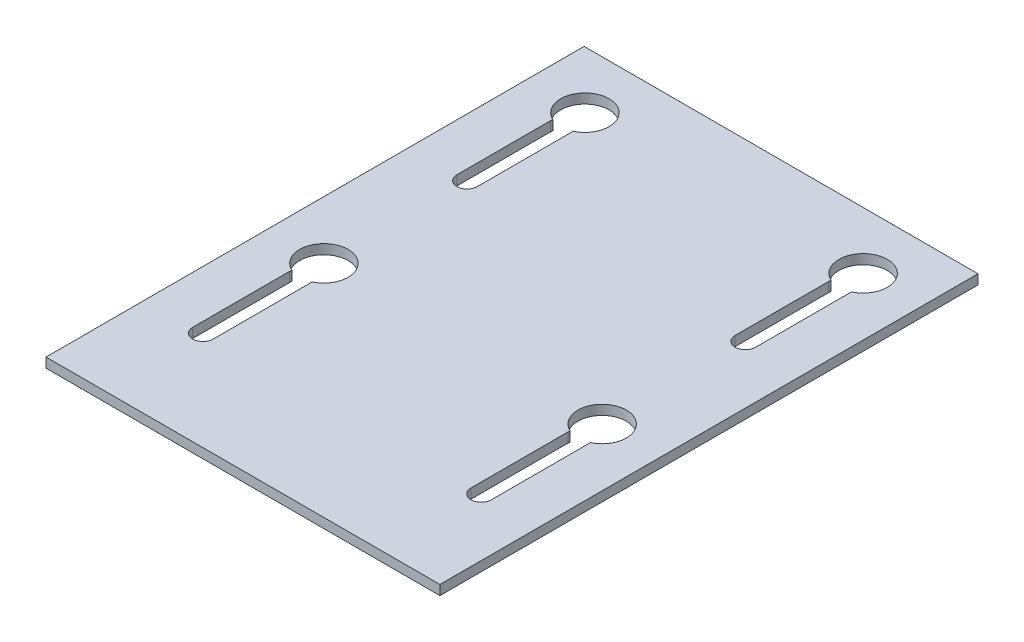
ISO-10303-21;
HEADER;
FILE_DESCRIPTION(('STEP AP214'),'2;1');
FILE_NAME('part.step','',(''),(''),'','','');
FILE_SCHEMA(('AUTOMOTIVE_DESIGN { 1 0 10303 214 1 1 1 1 }'));
ENDSEC;
DATA;
#1=APPLICATION_CONTEXT('core data for automotive mechanical design processes');
#2=APPLICATION_PROTOCOL_DEFINITION('international standard','automotive_design',2000,#1);
#3=PRODUCT_CONTEXT('',#1,'mechanical');
#4=PRODUCT('Part','Part','',(#3));
#5=PRODUCT_RELATED_PRODUCT_CATEGORY('part','',(#4));
#6=PRODUCT_DEFINITION_FORMATION('','',#4);
#7=PRODUCT_DEFINITION_CONTEXT('part definition',#1,'design');
#8=PRODUCT_DEFINITION('design','',#6,#7);
#9=PRODUCT_DEFINITION_SHAPE('','',#8);
#10=(LENGTH_UNIT() NAMED_UNIT(*) SI_UNIT(.MILLI.,.METRE.));
#11=(NAMED_UNIT(*) PLANE_ANGLE_UNIT() SI_UNIT($,.RADIAN.));
#12=(NAMED_UNIT(*) SI_UNIT($,.STERADIAN.) SOLID_ANGLE_UNIT());
#13=UNCERTAINTY_MEASURE_WITH_UNIT(LENGTH_MEASURE(1.E-05),#10,'distance_accuracy_value','');
#14=(GEOMETRIC_REPRESENTATION_CONTEXT(3) GLOBAL_UNCERTAINTY_ASSIGNED_CONTEXT((#13)) GLOBAL_UNIT_ASSIGNED_CONTEXT((#10,
#11,#12)) REPRESENTATION_CONTEXT('',''));
#15=CARTESIAN_POINT('',(0.,0.,0.));
#16=DIRECTION('',(0.,0.,1.));
#17=DIRECTION('',(1.,0.,0.));
#18=AXIS2_PLACEMENT_3D('',#15,#16,#17);
#19=CARTESIAN_POINT('',(0.,3.,0.));
#20=DIRECTION('',(0.,-1.,0.));
#21=DIRECTION('',(0.,0.,-1.));
#22=AXIS2_PLACEMENT_3D('',#19,#20,#21);
#23=PLANE('',#22);
#24=CARTESIAN_POINT('',(104.18,3.,-49.72));
#25=DIRECTION('',(0.,-1.,0.));
#26=DIRECTION('',(0.,0.,-1.));
#27=AXIS2_PLACEMENT_3D('',#24,#25,#26);
#28=CIRCLE('',#27,3.16499999999999);
#29=CARTESIAN_POINT('',(107.345,3.,-49.72));
#30=VERTEX_POINT('',#29);
#31=CARTESIAN_POINT('',(101.015,3.,-49.72));
#32=VERTEX_POINT('',#31);
#33=EDGE_CURVE('E359',#30,#32,#28,.T.);
#34=ORIENTED_EDGE('',*,*,#33,.T.);
#35=DIRECTION('',(0.,0.,1.));
#36=VECTOR('',#35,1.);
#37=CARTESIAN_POINT('',(101.015,3.,-79.72));
#38=LINE('',#37,#36);
#39=CARTESIAN_POINT('',(101.015,3.,-79.72));
#40=VERTEX_POINT('',#39);
#41=EDGE_CURVE('E355',#40,#32,#38,.T.);
#42=ORIENTED_EDGE('',*,*,#41,.F.);
#43=CARTESIAN_POINT('',(104.18,3.,-79.72));
#44=DIRECTION('',(0.,-1.,0.));
#45=DIRECTION('',(0.,0.,-1.));
#46=AXIS2_PLACEMENT_3D('',#43,#44,#45);
#47=CIRCLE('',#46,3.16499999999999);
#48=CARTESIAN_POINT('',(101.086256616043,3.,-80.387815));
#49=VERTEX_POINT('',#48);
#50=EDGE_CURVE('E368',#40,#49,#47,.T.);
#51=ORIENTED_EDGE('',*,*,#50,.T.);
#52=CARTESIAN_POINT('',(104.18,3.,-87.22));
#53=DIRECTION('',(0.,-1.,0.));
#54=DIRECTION('',(0.,0.,-1.));
#55=AXIS2_PLACEMENT_3D('',#52,#53,#54);
#56=CIRCLE('',#55,7.50000000000001);
#57=CARTESIAN_POINT('',(107.273743383957,3.,-80.387815));
#58=VERTEX_POINT('',#57);
#59=EDGE_CURVE('E345',#49,#58,#56,.T.);
#60=ORIENTED_EDGE('',*,*,#59,.T.);
#61=CARTESIAN_POINT('',(107.345,3.,-79.72));
#62=VERTEX_POINT('',#61);
#63=EDGE_CURVE('E372',#58,#62,#47,.T.);
#64=ORIENTED_EDGE('',*,*,#63,.T.);
#65=DIRECTION('',(0.,0.,1.));
#66=VECTOR('',#65,1.);
#67=CARTESIAN_POINT('',(107.345,3.,-79.72));
#68=LINE('',#67,#66);
#69=EDGE_CURVE('E364',#62,#30,#68,.T.);
#70=ORIENTED_EDGE('',*,*,#69,.T.);
#71=EDGE_LOOP('',(#34,#42,#51,#60,#64,#70));
#72=FACE_BOUND('',#71,.T.);
#73=CARTESIAN_POINT('',(104.18,3.,-131.62));
#74=DIRECTION('',(0.,-1.,0.));
#75=DIRECTION('',(0.,0.,-1.));
#76=AXIS2_PLACEMENT_3D('',#73,#74,#75);
#77=CIRCLE('',#76,3.16772898999997);
#78=CARTESIAN_POINT('',(107.34772899,3.,-131.62));
#79=VERTEX_POINT('',#78);
#80=CARTESIAN_POINT('',(101.01227101,3.,-131.62));
#81=VERTEX_POINT('',#80);
#82=EDGE_CURVE('E543',#79,#81,#77,.T.);
#83=ORIENTED_EDGE('',*,*,#82,.T.);
#84=DIRECTION('',(0.,0.,1.));
#85=VECTOR('',#84,1.);
#86=CARTESIAN_POINT('',(101.01227101,3.,-160.62));
#87=LINE('',#86,#85);
#88=CARTESIAN_POINT('',(101.01227101,3.,-160.62));
#89=VERTEX_POINT('',#88);
#90=EDGE_CURVE('E547',#89,#81,#87,.T.);
#91=ORIENTED_EDGE('',*,*,#90,.F.);
#92=CARTESIAN_POINT('',(104.18,3.,-160.62));
#93=DIRECTION('',(0.,-1.,0.));
#94=DIRECTION('',(0.,0.,-1.));
#95=AXIS2_PLACEMENT_3D('',#92,#93,#94);
#96=CIRCLE('',#95,3.16772898999995);
#97=CARTESIAN_POINT('',(101.083713525414,3.,-161.288967130272));
#98=VERTEX_POINT('',#97);
#99=EDGE_CURVE('E534',#89,#98,#96,.T.);
#100=ORIENTED_EDGE('',*,*,#99,.T.);
#101=CARTESIAN_POINT('',(104.18,3.,-168.12));
#102=DIRECTION('',(0.,-1.,0.));
#103=DIRECTION('',(0.,0.,-1.));
#104=AXIS2_PLACEMENT_3D('',#101,#102,#103);
#105=CIRCLE('',#104,7.50000000000003);
#106=CARTESIAN_POINT('',(107.276286474586,3.,-161.288967130272));
#107=VERTEX_POINT('',#106);
#108=EDGE_CURVE('E513',#98,#107,#105,.T.);
#109=ORIENTED_EDGE('',*,*,#108,.T.);
#110=CARTESIAN_POINT('',(107.34772899,3.,-160.62));
#111=VERTEX_POINT('',#110);
#112=EDGE_CURVE('E539',#107,#111,#96,.T.);
#113=ORIENTED_EDGE('',*,*,#112,.T.);
#114=DIRECTION('',(0.,0.,1.));
#115=VECTOR('',#114,1.);
#116=CARTESIAN_POINT('',(107.34772899,3.,-160.62));
#117=LINE('',#116,#115);
#118=EDGE_CURVE('E538',#111,#79,#117,.T.);
#119=ORIENTED_EDGE('',*,*,#118,.T.);
#120=EDGE_LOOP('',(#83,#91,#100,#109,#113,#119));
#121=FACE_BOUND('',#120,.T.);
#122=CARTESIAN_POINT('',(17.92,3.,-87.22));
#123=DIRECTION('',(0.,1.,0.));
#124=DIRECTION('',(0.,0.,1.));
#125=AXIS2_PLACEMENT_3D('',#122,#123,#124);
#126=CIRCLE('',#125,7.5);
#127=CARTESIAN_POINT('',(21.0137433839565,3.,-80.387815));
#128=VERTEX_POINT('',#127);
#129=CARTESIAN_POINT('',(14.8262566160434,3.,-80.387815));
#130=VERTEX_POINT('',#129);
#131=EDGE_CURVE('E337',#128,#130,#126,.T.);
#132=ORIENTED_EDGE('',*,*,#131,.F.);
#133=CARTESIAN_POINT('',(17.92,3.,-79.72));
#134=DIRECTION('',(0.,1.,0.));
#135=DIRECTION('',(0.,0.,1.));
#136=AXIS2_PLACEMENT_3D('',#133,#134,#135);
#137=CIRCLE('',#136,3.16499999999999);
#138=CARTESIAN_POINT('',(21.085,3.,-79.72));
#139=VERTEX_POINT('',#138);
#140=EDGE_CURVE('E433',#139,#128,#137,.T.);
#141=ORIENTED_EDGE('',*,*,#140,.F.);
#142=DIRECTION('',(0.,0.,1.));
#143=VECTOR('',#142,1.);
#144=CARTESIAN_POINT('',(21.085,3.,-79.72));
#145=LINE('',#144,#143);
#146=CARTESIAN_POINT('',(21.085,3.,-49.72));
#147=VERTEX_POINT('',#146);
#148=EDGE_CURVE('E420',#139,#147,#145,.T.);
#149=ORIENTED_EDGE('',*,*,#148,.T.);
#150=CARTESIAN_POINT('',(17.92,3.,-49.72));
#151=DIRECTION('',(0.,1.,0.));
#152=DIRECTION('',(0.,0.,1.));
#153=AXIS2_PLACEMENT_3D('',#150,#151,#152);
#154=CIRCLE('',#153,3.16499999999998);
#155=CARTESIAN_POINT('',(14.755,3.,-49.72));
#156=VERTEX_POINT('',#155);
#157=EDGE_CURVE('E424',#156,#147,#154,.T.);
#158=ORIENTED_EDGE('',*,*,#157,.F.);
#159=DIRECTION('',(0.,0.,1.));
#160=VECTOR('',#159,1.);
#161=CARTESIAN_POINT('',(14.755,3.,-79.72));
#162=LINE('',#161,#160);
#163=CARTESIAN_POINT('',(14.755,3.,-79.72));
#164=VERTEX_POINT('',#163);
#165=EDGE_CURVE('E429',#164,#156,#162,.T.);
#166=ORIENTED_EDGE('',*,*,#165,.F.);
#167=EDGE_CURVE('E406',#130,#164,#137,.T.);
#168=ORIENTED_EDGE('',*,*,#167,.F.);
#169=EDGE_LOOP('',(#132,#141,#149,#158,#166,#168));
#170=FACE_BOUND('',#169,.T.);
#171=DIRECTION('',(0.,0.,1.));
#172=VECTOR('',#171,1.);
#173=CARTESIAN_POINT('',(21.0877289899999,3.,-160.62));
#174=LINE('',#173,#172);
#175=CARTESIAN_POINT('',(21.0877289899999,3.,-160.62));
#176=VERTEX_POINT('',#175);
#177=CARTESIAN_POINT('',(21.0877289899999,3.,-131.62));
#178=VERTEX_POINT('',#177);
#179=EDGE_CURVE('E466',#176,#178,#174,.T.);
#180=ORIENTED_EDGE('',*,*,#179,.T.);
#181=CARTESIAN_POINT('',(17.92,3.,-131.62));
#182=DIRECTION('',(0.,1.,0.));
#183=DIRECTION('',(0.,0.,1.));
#184=AXIS2_PLACEMENT_3D('',#181,#182,#183);
#185=CIRCLE('',#184,3.16772898999996);
#186=CARTESIAN_POINT('',(14.75227101,3.,-131.62));
#187=VERTEX_POINT('',#186);
#188=EDGE_CURVE('E470',#187,#178,#185,.T.);
#189=ORIENTED_EDGE('',*,*,#188,.F.);
#190=DIRECTION('',(0.,0.,1.));
#191=VECTOR('',#190,1.);
#192=CARTESIAN_POINT('',(14.75227101,3.,-160.62));
#193=LINE('',#192,#191);
#194=CARTESIAN_POINT('',(14.75227101,3.,-160.62));
#195=VERTEX_POINT('',#194);
#196=EDGE_CURVE('E475',#195,#187,#193,.T.);
#197=ORIENTED_EDGE('',*,*,#196,.F.);
#198=CARTESIAN_POINT('',(17.92,3.,-160.62));
#199=DIRECTION('',(0.,1.,0.));
#200=DIRECTION('',(0.,0.,1.));
#201=AXIS2_PLACEMENT_3D('',#198,#199,#200);
#202=CIRCLE('',#201,3.16772898999996);
#203=CARTESIAN_POINT('',(14.8237135254144,3.,-161.288967130272));
#204=VERTEX_POINT('',#203);
#205=EDGE_CURVE('E395',#204,#195,#202,.T.);
#206=ORIENTED_EDGE('',*,*,#205,.F.);
#207=CARTESIAN_POINT('',(17.92,3.,-168.12));
#208=DIRECTION('',(0.,1.,0.));
#209=DIRECTION('',(0.,0.,1.));
#210=AXIS2_PLACEMENT_3D('',#207,#208,#209);
#211=CIRCLE('',#210,7.5);
#212=CARTESIAN_POINT('',(21.0162864745855,3.,-161.288967130272));
#213=VERTEX_POINT('',#212);
#214=EDGE_CURVE('E465',#213,#204,#211,.T.);
#215=ORIENTED_EDGE('',*,*,#214,.F.);
#216=EDGE_CURVE('E479',#176,#213,#202,.T.);
#217=ORIENTED_EDGE('',*,*,#216,.F.);
#218=EDGE_LOOP('',(#180,#189,#197,#206,#215,#217));
#219=FACE_BOUND('',#218,.T.);
#220=DIRECTION('',(-1.,0.,0.));
#221=VECTOR('',#220,1.);
#222=CARTESIAN_POINT('',(0.,3.,-19.));
#223=LINE('',#222,#221);
#224=CARTESIAN_POINT('',(122.1,3.,-19.));
#225=VERTEX_POINT('',#224);
#226=CARTESIAN_POINT('',(0.,3.,-19.));
#227=VERTEX_POINT('',#226);
#228=EDGE_CURVE('E286',#225,#227,#223,.T.);
#229=ORIENTED_EDGE('',*,*,#228,.F.);
#230=DIRECTION('',(0.,0.,-1.));
#231=VECTOR('',#230,1.);
#232=CARTESIAN_POINT('',(122.1,3.,0.));
#233=LINE('',#232,#231);
#234=CARTESIAN_POINT('',(122.1,3.,-185.8));
#235=VERTEX_POINT('',#234);
#236=EDGE_CURVE('E124',#225,#235,#233,.T.);
#237=ORIENTED_EDGE('',*,*,#236,.T.);
#238=DIRECTION('',(1.,0.,0.));
#239=VECTOR('',#238,1.);
#240=CARTESIAN_POINT('',(0.,3.,-185.8));
#241=LINE('',#240,#239);
#242=CARTESIAN_POINT('',(0.,3.,-185.8));
#243=VERTEX_POINT('',#242);
#244=EDGE_CURVE('E319',#243,#235,#241,.T.);
#245=ORIENTED_EDGE('',*,*,#244,.F.);
#246=DIRECTION('',(0.,0.,1.));
#247=VECTOR('',#246,1.);
#248=CARTESIAN_POINT('',(0.,3.,0.));
#249=LINE('',#248,#247);
#250=EDGE_CURVE('E292',#243,#227,#249,.T.);
#251=ORIENTED_EDGE('',*,*,#250,.T.);
#252=EDGE_LOOP('',(#229,#237,#245,#251));
#253=FACE_BOUND('',#252,.T.);
#254=ADVANCED_FACE('F101',(#72,#121,#170,#219,#253),#23,.F.);
#255=CARTESIAN_POINT('',(0.,0.,0.));
#256=DIRECTION('',(0.,-1.,0.));
#257=DIRECTION('',(0.,0.,-1.));
#258=AXIS2_PLACEMENT_3D('',#255,#256,#257);
#259=PLANE('',#258);
#260=CARTESIAN_POINT('',(17.92,0.,-79.72));
#261=DIRECTION('',(0.,1.,0.));
#262=DIRECTION('',(0.,0.,1.));
#263=AXIS2_PLACEMENT_3D('',#260,#261,#262);
#264=CIRCLE('',#263,3.16499999999999);
#265=CARTESIAN_POINT('',(21.085,0.,-79.72));
#266=VERTEX_POINT('',#265);
#267=CARTESIAN_POINT('',(21.0137433839565,0.,-80.387815));
#268=VERTEX_POINT('',#267);
#269=EDGE_CURVE('E446',#266,#268,#264,.T.);
#270=ORIENTED_EDGE('',*,*,#269,.T.);
#271=CARTESIAN_POINT('',(17.92,0.,-87.22));
#272=DIRECTION('',(0.,1.,0.));
#273=DIRECTION('',(0.,0.,1.));
#274=AXIS2_PLACEMENT_3D('',#271,#272,#273);
#275=CIRCLE('',#274,7.5);
#276=CARTESIAN_POINT('',(14.8262566160434,0.,-80.387815));
#277=VERTEX_POINT('',#276);
#278=EDGE_CURVE('E402',#268,#277,#275,.T.);
#279=ORIENTED_EDGE('',*,*,#278,.T.);
#280=CARTESIAN_POINT('',(14.755,0.,-79.72));
#281=VERTEX_POINT('',#280);
#282=EDGE_CURVE('E425',#277,#281,#264,.T.);
#283=ORIENTED_EDGE('',*,*,#282,.T.);
#284=DIRECTION('',(0.,0.,1.));
#285=VECTOR('',#284,1.);
#286=CARTESIAN_POINT('',(14.755,0.,-79.72));
#287=LINE('',#286,#285);
#288=CARTESIAN_POINT('',(14.755,0.,-49.72));
#289=VERTEX_POINT('',#288);
#290=EDGE_CURVE('E442',#281,#289,#287,.T.);
#291=ORIENTED_EDGE('',*,*,#290,.T.);
#292=CARTESIAN_POINT('',(17.92,0.,-49.72));
#293=DIRECTION('',(0.,1.,0.));
#294=DIRECTION('',(0.,0.,1.));
#295=AXIS2_PLACEMENT_3D('',#292,#293,#294);
#296=CIRCLE('',#295,3.16499999999998);
#297=CARTESIAN_POINT('',(21.085,0.,-49.72));
#298=VERTEX_POINT('',#297);
#299=EDGE_CURVE('E438',#289,#298,#296,.T.);
#300=ORIENTED_EDGE('',*,*,#299,.T.);
#301=DIRECTION('',(0.,0.,1.));
#302=VECTOR('',#301,1.);
#303=CARTESIAN_POINT('',(21.085,0.,-79.72));
#304=LINE('',#303,#302);
#305=EDGE_CURVE('E411',#266,#298,#304,.T.);
#306=ORIENTED_EDGE('',*,*,#305,.F.);
#307=EDGE_LOOP('',(#270,#279,#283,#291,#300,#306));
#308=FACE_BOUND('',#307,.T.);
#309=DIRECTION('',(0.,0.,1.));
#310=VECTOR('',#309,1.);
#311=CARTESIAN_POINT('',(101.015,0.,-79.72));
#312=LINE('',#311,#310);
#313=CARTESIAN_POINT('',(101.015,0.,-79.72));
#314=VERTEX_POINT('',#313);
#315=CARTESIAN_POINT('',(101.015,0.,-49.72));
#316=VERTEX_POINT('',#315);
#317=EDGE_CURVE('E354',#314,#316,#312,.T.);
#318=ORIENTED_EDGE('',*,*,#317,.T.);
#319=CARTESIAN_POINT('',(104.18,0.,-49.72));
#320=DIRECTION('',(0.,-1.,0.));
#321=DIRECTION('',(0.,0.,-1.));
#322=AXIS2_PLACEMENT_3D('',#319,#320,#321);
#323=CIRCLE('',#322,3.16499999999999);
#324=CARTESIAN_POINT('',(107.345,0.,-49.72));
#325=VERTEX_POINT('',#324);
#326=EDGE_CURVE('E376',#325,#316,#323,.T.);
#327=ORIENTED_EDGE('',*,*,#326,.F.);
#328=DIRECTION('',(0.,0.,1.));
#329=VECTOR('',#328,1.);
#330=CARTESIAN_POINT('',(107.345,0.,-79.72));
#331=LINE('',#330,#329);
#332=CARTESIAN_POINT('',(107.345,0.,-79.72));
#333=VERTEX_POINT('',#332);
#334=EDGE_CURVE('E379',#333,#325,#331,.T.);
#335=ORIENTED_EDGE('',*,*,#334,.F.);
#336=CARTESIAN_POINT('',(104.18,0.,-79.72));
#337=DIRECTION('',(0.,-1.,0.));
#338=DIRECTION('',(0.,0.,-1.));
#339=AXIS2_PLACEMENT_3D('',#336,#337,#338);
#340=CIRCLE('',#339,3.16499999999999);
#341=CARTESIAN_POINT('',(107.273743383957,0.,-80.387815));
#342=VERTEX_POINT('',#341);
#343=EDGE_CURVE('E360',#342,#333,#340,.T.);
#344=ORIENTED_EDGE('',*,*,#343,.F.);
#345=CARTESIAN_POINT('',(104.18,0.,-87.22));
#346=DIRECTION('',(0.,-1.,0.));
#347=DIRECTION('',(0.,0.,-1.));
#348=AXIS2_PLACEMENT_3D('',#345,#346,#347);
#349=CIRCLE('',#348,7.50000000000001);
#350=CARTESIAN_POINT('',(101.086256616043,0.,-80.387815));
#351=VERTEX_POINT('',#350);
#352=EDGE_CURVE('E340',#351,#342,#349,.T.);
#353=ORIENTED_EDGE('',*,*,#352,.F.);
#354=EDGE_CURVE('E382',#314,#351,#340,.T.);
#355=ORIENTED_EDGE('',*,*,#354,.F.);
#356=EDGE_LOOP('',(#318,#327,#335,#344,#353,#355));
#357=FACE_BOUND('',#356,.T.);
#358=DIRECTION('',(0.,0.,1.));
#359=VECTOR('',#358,1.);
#360=CARTESIAN_POINT('',(101.01227101,0.,-160.62));
#361=LINE('',#360,#359);
#362=CARTESIAN_POINT('',(101.01227101,0.,-160.62));
#363=VERTEX_POINT('',#362);
#364=CARTESIAN_POINT('',(101.01227101,0.,-131.62));
#365=VERTEX_POINT('',#364);
#366=EDGE_CURVE('E529',#363,#365,#361,.T.);
#367=ORIENTED_EDGE('',*,*,#366,.T.);
#368=CARTESIAN_POINT('',(104.18,0.,-131.62));
#369=DIRECTION('',(0.,-1.,0.));
#370=DIRECTION('',(0.,0.,-1.));
#371=AXIS2_PLACEMENT_3D('',#368,#369,#370);
#372=CIRCLE('',#371,3.16772898999997);
#373=CARTESIAN_POINT('',(107.34772899,0.,-131.62));
#374=VERTEX_POINT('',#373);
#375=EDGE_CURVE('E526',#374,#365,#372,.T.);
#376=ORIENTED_EDGE('',*,*,#375,.F.);
#377=DIRECTION('',(0.,0.,1.));
#378=VECTOR('',#377,1.);
#379=CARTESIAN_POINT('',(107.34772899,0.,-160.62));
#380=LINE('',#379,#378);
#381=CARTESIAN_POINT('',(107.34772899,0.,-160.62));
#382=VERTEX_POINT('',#381);
#383=EDGE_CURVE('E522',#382,#374,#380,.T.);
#384=ORIENTED_EDGE('',*,*,#383,.F.);
#385=CARTESIAN_POINT('',(104.18,0.,-160.62));
#386=DIRECTION('',(0.,-1.,0.));
#387=DIRECTION('',(0.,0.,-1.));
#388=AXIS2_PLACEMENT_3D('',#385,#386,#387);
#389=CIRCLE('',#388,3.16772898999995);
#390=CARTESIAN_POINT('',(107.276286474586,0.,-161.288967130272));
#391=VERTEX_POINT('',#390);
#392=EDGE_CURVE('E523',#391,#382,#389,.T.);
#393=ORIENTED_EDGE('',*,*,#392,.F.);
#394=CARTESIAN_POINT('',(104.18,0.,-168.12));
#395=DIRECTION('',(0.,-1.,0.));
#396=DIRECTION('',(0.,0.,-1.));
#397=AXIS2_PLACEMENT_3D('',#394,#395,#396);
#398=CIRCLE('',#397,7.50000000000003);
#399=CARTESIAN_POINT('',(101.083713525414,0.,-161.288967130272));
#400=VERTEX_POINT('',#399);
#401=EDGE_CURVE('E509',#400,#391,#398,.T.);
#402=ORIENTED_EDGE('',*,*,#401,.F.);
#403=EDGE_CURVE('E518',#363,#400,#389,.T.);
#404=ORIENTED_EDGE('',*,*,#403,.F.);
#405=EDGE_LOOP('',(#367,#376,#384,#393,#402,#404));
#406=FACE_BOUND('',#405,.T.);
#407=CARTESIAN_POINT('',(17.92,0.,-131.62));
#408=DIRECTION('',(0.,1.,0.));
#409=DIRECTION('',(0.,0.,1.));
#410=AXIS2_PLACEMENT_3D('',#407,#408,#409);
#411=CIRCLE('',#410,3.16772898999996);
#412=CARTESIAN_POINT('',(14.75227101,0.,-131.62));
#413=VERTEX_POINT('',#412);
#414=CARTESIAN_POINT('',(21.0877289899999,0.,-131.62));
#415=VERTEX_POINT('',#414);
#416=EDGE_CURVE('E485',#413,#415,#411,.T.);
#417=ORIENTED_EDGE('',*,*,#416,.T.);
#418=DIRECTION('',(0.,0.,1.));
#419=VECTOR('',#418,1.);
#420=CARTESIAN_POINT('',(21.0877289899999,0.,-160.62));
#421=LINE('',#420,#419);
#422=CARTESIAN_POINT('',(21.0877289899999,0.,-160.62));
#423=VERTEX_POINT('',#422);
#424=EDGE_CURVE('E454',#423,#415,#421,.T.);
#425=ORIENTED_EDGE('',*,*,#424,.F.);
#426=CARTESIAN_POINT('',(17.92,0.,-160.62));
#427=DIRECTION('',(0.,1.,0.));
#428=DIRECTION('',(0.,0.,1.));
#429=AXIS2_PLACEMENT_3D('',#426,#427,#428);
#430=CIRCLE('',#429,3.16772898999996);
#431=CARTESIAN_POINT('',(21.0162864745855,0.,-161.288967130272));
#432=VERTEX_POINT('',#431);
#433=EDGE_CURVE('E493',#423,#432,#430,.T.);
#434=ORIENTED_EDGE('',*,*,#433,.T.);
#435=CARTESIAN_POINT('',(17.92,0.,-168.12));
#436=DIRECTION('',(0.,1.,0.));
#437=DIRECTION('',(0.,0.,1.));
#438=AXIS2_PLACEMENT_3D('',#435,#436,#437);
#439=CIRCLE('',#438,7.5);
#440=CARTESIAN_POINT('',(14.8237135254144,0.,-161.288967130272));
#441=VERTEX_POINT('',#440);
#442=EDGE_CURVE('E500',#432,#441,#439,.T.);
#443=ORIENTED_EDGE('',*,*,#442,.T.);
#444=CARTESIAN_POINT('',(14.75227101,0.,-160.62));
#445=VERTEX_POINT('',#444);
#446=EDGE_CURVE('E471',#441,#445,#430,.T.);
#447=ORIENTED_EDGE('',*,*,#446,.T.);
#448=DIRECTION('',(0.,0.,1.));
#449=VECTOR('',#448,1.);
#450=CARTESIAN_POINT('',(14.75227101,0.,-160.62));
#451=LINE('',#450,#449);
#452=EDGE_CURVE('E489',#445,#413,#451,.T.);
#453=ORIENTED_EDGE('',*,*,#452,.T.);
#454=EDGE_LOOP('',(#417,#425,#434,#443,#447,#453));
#455=FACE_BOUND('',#454,.T.);
#456=DIRECTION('',(0.,0.,-1.));
#457=VECTOR('',#456,1.);
#458=CARTESIAN_POINT('',(122.1,0.,0.));
#459=LINE('',#458,#457);
#460=CARTESIAN_POINT('',(122.1,0.,-19.));
#461=VERTEX_POINT('',#460);
#462=CARTESIAN_POINT('',(122.1,0.,-185.8));
#463=VERTEX_POINT('',#462);
#464=EDGE_CURVE('E303',#461,#463,#459,.T.);
#465=ORIENTED_EDGE('',*,*,#464,.F.);
#466=DIRECTION('',(-1.,0.,0.));
#467=VECTOR('',#466,1.);
#468=CARTESIAN_POINT('',(0.,0.,-19.));
#469=LINE('',#468,#467);
#470=CARTESIAN_POINT('',(0.,0.,-19.));
#471=VERTEX_POINT('',#470);
#472=EDGE_CURVE('E116',#461,#471,#469,.T.);
#473=ORIENTED_EDGE('',*,*,#472,.T.);
#474=DIRECTION('',(0.,0.,1.));
#475=VECTOR('',#474,1.);
#476=CARTESIAN_POINT('',(0.,0.,0.));
#477=LINE('',#476,#475);
#478=CARTESIAN_POINT('',(0.,0.,-185.8));
#479=VERTEX_POINT('',#478);
#480=EDGE_CURVE('E307',#479,#471,#477,.T.);
#481=ORIENTED_EDGE('',*,*,#480,.F.);
#482=DIRECTION('',(1.,0.,0.));
#483=VECTOR('',#482,1.);
#484=CARTESIAN_POINT('',(0.,0.,-185.8));
#485=LINE('',#484,#483);
#486=EDGE_CURVE('E317',#479,#463,#485,.T.);
#487=ORIENTED_EDGE('',*,*,#486,.T.);
#488=EDGE_LOOP('',(#465,#473,#481,#487));
#489=FACE_BOUND('',#488,.T.);
#490=ADVANCED_FACE('F321',(#308,#357,#406,#455,#489),#259,.T.);
#491=CARTESIAN_POINT('',(0.,3.,0.));
#492=DIRECTION('',(1.,0.,0.));
#493=DIRECTION('',(0.,0.,-1.));
#494=AXIS2_PLACEMENT_3D('',#491,#492,#493);
#495=PLANE('',#494);
#496=DIRECTION('',(0.,-1.,0.));
#497=VECTOR('',#496,1.);
#498=CARTESIAN_POINT('',(0.,3.,-19.));
#499=LINE('',#498,#497);
#500=EDGE_CURVE('E294',#227,#471,#499,.T.);
#501=ORIENTED_EDGE('',*,*,#500,.F.);
#502=ORIENTED_EDGE('',*,*,#250,.F.);
#503=DIRECTION('',(0.,1.,0.));
#504=VECTOR('',#503,1.);
#505=CARTESIAN_POINT('',(0.,3.,-185.8));
#506=LINE('',#505,#504);
#507=EDGE_CURVE('E326',#479,#243,#506,.T.);
#508=ORIENTED_EDGE('',*,*,#507,.F.);
#509=ORIENTED_EDGE('',*,*,#480,.T.);
#510=EDGE_LOOP('',(#501,#502,#508,#509));
#511=FACE_BOUND('',#510,.T.);
#512=ADVANCED_FACE('F103',(#511),#495,.F.);
#513=CARTESIAN_POINT('',(122.1,3.,0.));
#514=DIRECTION('',(-1.,0.,0.));
#515=DIRECTION('',(0.,0.,1.));
#516=AXIS2_PLACEMENT_3D('',#513,#514,#515);
#517=PLANE('',#516);
#518=DIRECTION('',(0.,1.,0.));
#519=VECTOR('',#518,1.);
#520=CARTESIAN_POINT('',(122.1,3.,-19.));
#521=LINE('',#520,#519);
#522=EDGE_CURVE('E12',#461,#225,#521,.T.);
#523=ORIENTED_EDGE('',*,*,#522,.F.);
#524=ORIENTED_EDGE('',*,*,#464,.T.);
#525=DIRECTION('',(0.,-1.,0.));
#526=VECTOR('',#525,1.);
#527=CARTESIAN_POINT('',(122.1,3.,-185.8));
#528=LINE('',#527,#526);
#529=EDGE_CURVE('E110',#235,#463,#528,.T.);
#530=ORIENTED_EDGE('',*,*,#529,.F.);
#531=ORIENTED_EDGE('',*,*,#236,.F.);
#532=EDGE_LOOP('',(#523,#524,#530,#531));
#533=FACE_BOUND('',#532,.T.);
#534=ADVANCED_FACE('F297',(#533),#517,.F.);
#535=CARTESIAN_POINT('',(104.18,0.,-168.12));
#536=DIRECTION('',(0.,1.,0.));
#537=DIRECTION('',(0.,0.,1.));
#538=AXIS2_PLACEMENT_3D('',#535,#536,#537);
#539=CYLINDRICAL_SURFACE('',#538,7.50000000000003);
#540=DIRECTION('',(0.,1.,0.));
#541=VECTOR('',#540,1.);
#542=CARTESIAN_POINT('',(107.276286474586,1.5,-161.288967130272));
#543=LINE('',#542,#541);
#544=EDGE_CURVE('E311',#391,#107,#543,.T.);
#545=ORIENTED_EDGE('',*,*,#544,.T.);
#546=ORIENTED_EDGE('',*,*,#108,.F.);
#547=DIRECTION('',(0.,1.,0.));
#548=VECTOR('',#547,1.);
#549=CARTESIAN_POINT('',(101.083713525414,1.5,-161.288967130272));
#550=LINE('',#549,#548);
#551=EDGE_CURVE('E512',#98,#400,#550,.F.);
#552=ORIENTED_EDGE('',*,*,#551,.T.);
#553=ORIENTED_EDGE('',*,*,#401,.T.);
#554=EDGE_LOOP('',(#545,#546,#552,#553));
#555=FACE_BOUND('',#554,.T.);
#556=ADVANCED_FACE('F567',(#555),#539,.F.);
#557=CARTESIAN_POINT('',(107.34772899,0.,-160.62));
#558=DIRECTION('',(-1.,0.,0.));
#559=DIRECTION('',(0.,0.,1.));
#560=AXIS2_PLACEMENT_3D('',#557,#558,#559);
#561=PLANE('',#560);
#562=ORIENTED_EDGE('',*,*,#118,.F.);
#563=DIRECTION('',(0.,1.,0.));
#564=VECTOR('',#563,1.);
#565=CARTESIAN_POINT('',(107.34772899,0.,-160.62));
#566=LINE('',#565,#564);
#567=EDGE_CURVE('E517',#382,#111,#566,.T.);
#568=ORIENTED_EDGE('',*,*,#567,.F.);
#569=ORIENTED_EDGE('',*,*,#383,.T.);
#570=DIRECTION('',(0.,1.,0.));
#571=VECTOR('',#570,1.);
#572=CARTESIAN_POINT('',(107.34772899,0.,-131.62));
#573=LINE('',#572,#571);
#574=EDGE_CURVE('E556',#374,#79,#573,.T.);
#575=ORIENTED_EDGE('',*,*,#574,.T.);
#576=EDGE_LOOP('',(#562,#568,#569,#575));
#577=FACE_BOUND('',#576,.T.);
#578=ADVANCED_FACE('F640',(#577),#561,.T.);
#579=CARTESIAN_POINT('',(104.18,0.,-131.62));
#580=DIRECTION('',(0.,1.,0.));
#581=DIRECTION('',(0.,0.,1.));
#582=AXIS2_PLACEMENT_3D('',#579,#580,#581);
#583=CYLINDRICAL_SURFACE('',#582,3.16772898999997);
#584=ORIENTED_EDGE('',*,*,#82,.F.);
#585=ORIENTED_EDGE('',*,*,#574,.F.);
#586=ORIENTED_EDGE('',*,*,#375,.T.);
#587=DIRECTION('',(0.,1.,0.));
#588=VECTOR('',#587,1.);
#589=CARTESIAN_POINT('',(101.01227101,0.,-131.62));
#590=LINE('',#589,#588);
#591=EDGE_CURVE('E553',#365,#81,#590,.T.);
#592=ORIENTED_EDGE('',*,*,#591,.T.);
#593=EDGE_LOOP('',(#584,#585,#586,#592));
#594=FACE_BOUND('',#593,.T.);
#595=ADVANCED_FACE('F728',(#594),#583,.F.);
#596=CARTESIAN_POINT('',(101.01227101,0.,-160.62));
#597=DIRECTION('',(-1.,0.,0.));
#598=DIRECTION('',(0.,0.,1.));
#599=AXIS2_PLACEMENT_3D('',#596,#597,#598);
#600=PLANE('',#599);
#601=ORIENTED_EDGE('',*,*,#90,.T.);
#602=ORIENTED_EDGE('',*,*,#591,.F.);
#603=ORIENTED_EDGE('',*,*,#366,.F.);
#604=DIRECTION('',(0.,1.,0.));
#605=VECTOR('',#604,1.);
#606=CARTESIAN_POINT('',(101.01227101,0.,-160.62));
#607=LINE('',#606,#605);
#608=EDGE_CURVE('E533',#363,#89,#607,.T.);
#609=ORIENTED_EDGE('',*,*,#608,.T.);
#610=EDGE_LOOP('',(#601,#602,#603,#609));
#611=FACE_BOUND('',#610,.T.);
#612=ADVANCED_FACE('F695',(#611),#600,.F.);
#613=CARTESIAN_POINT('',(104.18,0.,-160.62));
#614=DIRECTION('',(0.,1.,0.));
#615=DIRECTION('',(0.,0.,1.));
#616=AXIS2_PLACEMENT_3D('',#613,#614,#615);
#617=CYLINDRICAL_SURFACE('',#616,3.16772898999995);
#618=ORIENTED_EDGE('',*,*,#99,.F.);
#619=ORIENTED_EDGE('',*,*,#608,.F.);
#620=ORIENTED_EDGE('',*,*,#403,.T.);
#621=ORIENTED_EDGE('',*,*,#551,.F.);
#622=EDGE_LOOP('',(#618,#619,#620,#621));
#623=FACE_BOUND('',#622,.T.);
#624=ADVANCED_FACE('F581',(#623),#617,.F.);
#625=ORIENTED_EDGE('',*,*,#392,.T.);
#626=ORIENTED_EDGE('',*,*,#567,.T.);
#627=ORIENTED_EDGE('',*,*,#112,.F.);
#628=ORIENTED_EDGE('',*,*,#544,.F.);
#629=EDGE_LOOP('',(#625,#626,#627,#628));
#630=FACE_BOUND('',#629,.T.);
#631=ADVANCED_FACE('F572',(#630),#617,.F.);
#632=CARTESIAN_POINT('',(104.18,0.,-87.22));
#633=DIRECTION('',(0.,1.,0.));
#634=DIRECTION('',(0.,0.,1.));
#635=AXIS2_PLACEMENT_3D('',#632,#633,#634);
#636=CYLINDRICAL_SURFACE('',#635,7.50000000000001);
#637=DIRECTION('',(0.,1.,0.));
#638=VECTOR('',#637,1.);
#639=CARTESIAN_POINT('',(107.273743383957,1.5,-80.387815));
#640=LINE('',#639,#638);
#641=EDGE_CURVE('E333',#342,#58,#640,.T.);
#642=ORIENTED_EDGE('',*,*,#641,.T.);
#643=ORIENTED_EDGE('',*,*,#59,.F.);
#644=DIRECTION('',(0.,1.,0.));
#645=VECTOR('',#644,1.);
#646=CARTESIAN_POINT('',(101.086256616043,1.5,-80.387815));
#647=LINE('',#646,#645);
#648=EDGE_CURVE('E336',#49,#351,#647,.F.);
#649=ORIENTED_EDGE('',*,*,#648,.T.);
#650=ORIENTED_EDGE('',*,*,#352,.T.);
#651=EDGE_LOOP('',(#642,#643,#649,#650));
#652=FACE_BOUND('',#651,.T.);
#653=ADVANCED_FACE('F679',(#652),#636,.F.);
#654=CARTESIAN_POINT('',(107.345,0.,-79.72));
#655=DIRECTION('',(-1.,0.,0.));
#656=DIRECTION('',(0.,0.,1.));
#657=AXIS2_PLACEMENT_3D('',#654,#655,#656);
#658=PLANE('',#657);
#659=ORIENTED_EDGE('',*,*,#69,.F.);
#660=DIRECTION('',(0.,1.,0.));
#661=VECTOR('',#660,1.);
#662=CARTESIAN_POINT('',(107.345,0.,-79.72));
#663=LINE('',#662,#661);
#664=EDGE_CURVE('E341',#333,#62,#663,.T.);
#665=ORIENTED_EDGE('',*,*,#664,.F.);
#666=ORIENTED_EDGE('',*,*,#334,.T.);
#667=DIRECTION('',(0.,1.,0.));
#668=VECTOR('',#667,1.);
#669=CARTESIAN_POINT('',(107.345,0.,-49.72));
#670=LINE('',#669,#668);
#671=EDGE_CURVE('E344',#325,#30,#670,.T.);
#672=ORIENTED_EDGE('',*,*,#671,.T.);
#673=EDGE_LOOP('',(#659,#665,#666,#672));
#674=FACE_BOUND('',#673,.T.);
#675=ADVANCED_FACE('F680',(#674),#658,.T.);
#676=CARTESIAN_POINT('',(104.18,0.,-49.72));
#677=DIRECTION('',(0.,1.,0.));
#678=DIRECTION('',(0.,0.,1.));
#679=AXIS2_PLACEMENT_3D('',#676,#677,#678);
#680=CYLINDRICAL_SURFACE('',#679,3.16499999999999);
#681=ORIENTED_EDGE('',*,*,#33,.F.);
#682=ORIENTED_EDGE('',*,*,#671,.F.);
#683=ORIENTED_EDGE('',*,*,#326,.T.);
#684=DIRECTION('',(0.,1.,0.));
#685=VECTOR('',#684,1.);
#686=CARTESIAN_POINT('',(101.015,0.,-49.72));
#687=LINE('',#686,#685);
#688=EDGE_CURVE('E348',#316,#32,#687,.T.);
#689=ORIENTED_EDGE('',*,*,#688,.T.);
#690=EDGE_LOOP('',(#681,#682,#683,#689));
#691=FACE_BOUND('',#690,.T.);
#692=ADVANCED_FACE('F683',(#691),#680,.F.);
#693=CARTESIAN_POINT('',(101.015,0.,-79.72));
#694=DIRECTION('',(-1.,0.,0.));
#695=DIRECTION('',(0.,0.,1.));
#696=AXIS2_PLACEMENT_3D('',#693,#694,#695);
#697=PLANE('',#696);
#698=ORIENTED_EDGE('',*,*,#41,.T.);
#699=ORIENTED_EDGE('',*,*,#688,.F.);
#700=ORIENTED_EDGE('',*,*,#317,.F.);
#701=DIRECTION('',(0.,1.,0.));
#702=VECTOR('',#701,1.);
#703=CARTESIAN_POINT('',(101.015,0.,-79.72));
#704=LINE('',#703,#702);
#705=EDGE_CURVE('E351',#314,#40,#704,.T.);
#706=ORIENTED_EDGE('',*,*,#705,.T.);
#707=EDGE_LOOP('',(#698,#699,#700,#706));
#708=FACE_BOUND('',#707,.T.);
#709=ADVANCED_FACE('F687',(#708),#697,.F.);
#710=CARTESIAN_POINT('',(104.18,0.,-79.72));
#711=DIRECTION('',(0.,1.,0.));
#712=DIRECTION('',(0.,0.,1.));
#713=AXIS2_PLACEMENT_3D('',#710,#711,#712);
#714=CYLINDRICAL_SURFACE('',#713,3.16499999999999);
#715=ORIENTED_EDGE('',*,*,#50,.F.);
#716=ORIENTED_EDGE('',*,*,#705,.F.);
#717=ORIENTED_EDGE('',*,*,#354,.T.);
#718=ORIENTED_EDGE('',*,*,#648,.F.);
#719=EDGE_LOOP('',(#715,#716,#717,#718));
#720=FACE_BOUND('',#719,.T.);
#721=ADVANCED_FACE('F677',(#720),#714,.F.);
#722=ORIENTED_EDGE('',*,*,#343,.T.);
#723=ORIENTED_EDGE('',*,*,#664,.T.);
#724=ORIENTED_EDGE('',*,*,#63,.F.);
#725=ORIENTED_EDGE('',*,*,#641,.F.);
#726=EDGE_LOOP('',(#722,#723,#724,#725));
#727=FACE_BOUND('',#726,.T.);
#728=ADVANCED_FACE('F673',(#727),#714,.F.);
#729=CARTESIAN_POINT('',(17.92,0.,-79.72));
#730=DIRECTION('',(0.,1.,0.));
#731=DIRECTION('',(0.,0.,1.));
#732=AXIS2_PLACEMENT_3D('',#729,#730,#731);
#733=CYLINDRICAL_SURFACE('',#732,3.16499999999999);
#734=DIRECTION('',(0.,1.,0.));
#735=VECTOR('',#734,1.);
#736=CARTESIAN_POINT('',(21.0137433839565,1.5,-80.387815));
#737=LINE('',#736,#735);
#738=EDGE_CURVE('E394',#128,#268,#737,.F.);
#739=ORIENTED_EDGE('',*,*,#738,.T.);
#740=ORIENTED_EDGE('',*,*,#269,.F.);
#741=DIRECTION('',(0.,1.,0.));
#742=VECTOR('',#741,1.);
#743=CARTESIAN_POINT('',(21.085,0.,-79.72));
#744=LINE('',#743,#742);
#745=EDGE_CURVE('E398',#266,#139,#744,.T.);
#746=ORIENTED_EDGE('',*,*,#745,.T.);
#747=ORIENTED_EDGE('',*,*,#140,.T.);
#748=EDGE_LOOP('',(#739,#740,#746,#747));
#749=FACE_BOUND('',#748,.T.);
#750=ADVANCED_FACE('F676',(#749),#733,.F.);
#751=CARTESIAN_POINT('',(21.085,0.,-79.72));
#752=DIRECTION('',(-1.,0.,0.));
#753=DIRECTION('',(0.,0.,1.));
#754=AXIS2_PLACEMENT_3D('',#751,#752,#753);
#755=PLANE('',#754);
#756=ORIENTED_EDGE('',*,*,#148,.F.);
#757=ORIENTED_EDGE('',*,*,#745,.F.);
#758=ORIENTED_EDGE('',*,*,#305,.T.);
#759=DIRECTION('',(0.,1.,0.));
#760=VECTOR('',#759,1.);
#761=CARTESIAN_POINT('',(21.085,0.,-49.72));
#762=LINE('',#761,#760);
#763=EDGE_CURVE('E415',#298,#147,#762,.T.);
#764=ORIENTED_EDGE('',*,*,#763,.T.);
#765=EDGE_LOOP('',(#756,#757,#758,#764));
#766=FACE_BOUND('',#765,.T.);
#767=ADVANCED_FACE('F703',(#766),#755,.T.);
#768=CARTESIAN_POINT('',(17.92,0.,-49.72));
#769=DIRECTION('',(0.,1.,0.));
#770=DIRECTION('',(0.,0.,1.));
#771=AXIS2_PLACEMENT_3D('',#768,#769,#770);
#772=CYLINDRICAL_SURFACE('',#771,3.16499999999998);
#773=ORIENTED_EDGE('',*,*,#157,.T.);
#774=ORIENTED_EDGE('',*,*,#763,.F.);
#775=ORIENTED_EDGE('',*,*,#299,.F.);
#776=DIRECTION('',(0.,1.,0.));
#777=VECTOR('',#776,1.);
#778=CARTESIAN_POINT('',(14.755,0.,-49.72));
#779=LINE('',#778,#777);
#780=EDGE_CURVE('E412',#289,#156,#779,.T.);
#781=ORIENTED_EDGE('',*,*,#780,.T.);
#782=EDGE_LOOP('',(#773,#774,#775,#781));
#783=FACE_BOUND('',#782,.T.);
#784=ADVANCED_FACE('F708',(#783),#772,.F.);
#785=CARTESIAN_POINT('',(14.755,0.,-79.72));
#786=DIRECTION('',(-1.,0.,0.));
#787=DIRECTION('',(0.,0.,1.));
#788=AXIS2_PLACEMENT_3D('',#785,#786,#787);
#789=PLANE('',#788);
#790=ORIENTED_EDGE('',*,*,#165,.T.);
#791=ORIENTED_EDGE('',*,*,#780,.F.);
#792=ORIENTED_EDGE('',*,*,#290,.F.);
#793=DIRECTION('',(0.,1.,0.));
#794=VECTOR('',#793,1.);
#795=CARTESIAN_POINT('',(14.755,0.,-79.72));
#796=LINE('',#795,#794);
#797=EDGE_CURVE('E407',#281,#164,#796,.T.);
#798=ORIENTED_EDGE('',*,*,#797,.T.);
#799=EDGE_LOOP('',(#790,#791,#792,#798));
#800=FACE_BOUND('',#799,.T.);
#801=ADVANCED_FACE('F705',(#800),#789,.F.);
#802=DIRECTION('',(0.,1.,0.));
#803=VECTOR('',#802,1.);
#804=CARTESIAN_POINT('',(14.8262566160434,1.5,-80.387815));
#805=LINE('',#804,#803);
#806=EDGE_CURVE('E391',#277,#130,#805,.T.);
#807=ORIENTED_EDGE('',*,*,#806,.T.);
#808=ORIENTED_EDGE('',*,*,#167,.T.);
#809=ORIENTED_EDGE('',*,*,#797,.F.);
#810=ORIENTED_EDGE('',*,*,#282,.F.);
#811=EDGE_LOOP('',(#807,#808,#809,#810));
#812=FACE_BOUND('',#811,.T.);
#813=ADVANCED_FACE('F699',(#812),#733,.F.);
#814=CARTESIAN_POINT('',(17.92,0.,-87.22));
#815=DIRECTION('',(0.,1.,0.));
#816=DIRECTION('',(0.,0.,1.));
#817=AXIS2_PLACEMENT_3D('',#814,#815,#816);
#818=CYLINDRICAL_SURFACE('',#817,7.5);
#819=ORIENTED_EDGE('',*,*,#278,.F.);
#820=ORIENTED_EDGE('',*,*,#738,.F.);
#821=ORIENTED_EDGE('',*,*,#131,.T.);
#822=ORIENTED_EDGE('',*,*,#806,.F.);
#823=EDGE_LOOP('',(#819,#820,#821,#822));
#824=FACE_BOUND('',#823,.T.);
#825=ADVANCED_FACE('F696',(#824),#818,.F.);
#826=CARTESIAN_POINT('',(17.92,0.,-168.12));
#827=DIRECTION('',(0.,1.,0.));
#828=DIRECTION('',(0.,0.,1.));
#829=AXIS2_PLACEMENT_3D('',#826,#827,#828);
#830=CYLINDRICAL_SURFACE('',#829,7.5);
#831=ORIENTED_EDGE('',*,*,#214,.T.);
#832=DIRECTION('',(0.,1.,0.));
#833=VECTOR('',#832,1.);
#834=CARTESIAN_POINT('',(14.8237135254144,0.,-161.288967130272));
#835=LINE('',#834,#833);
#836=EDGE_CURVE('E332',#441,#204,#835,.T.);
#837=ORIENTED_EDGE('',*,*,#836,.F.);
#838=ORIENTED_EDGE('',*,*,#442,.F.);
#839=DIRECTION('',(0.,1.,0.));
#840=VECTOR('',#839,1.);
#841=CARTESIAN_POINT('',(21.0162864745855,0.,-161.288967130272));
#842=LINE('',#841,#840);
#843=EDGE_CURVE('E497',#432,#213,#842,.T.);
#844=ORIENTED_EDGE('',*,*,#843,.T.);
#845=EDGE_LOOP('',(#831,#837,#838,#844));
#846=FACE_BOUND('',#845,.T.);
#847=ADVANCED_FACE('F621',(#846),#830,.F.);
#848=CARTESIAN_POINT('',(21.0877289899999,0.,-160.62));
#849=DIRECTION('',(-1.,0.,0.));
#850=DIRECTION('',(0.,0.,1.));
#851=AXIS2_PLACEMENT_3D('',#848,#849,#850);
#852=PLANE('',#851);
#853=ORIENTED_EDGE('',*,*,#179,.F.);
#854=DIRECTION('',(0.,1.,0.));
#855=VECTOR('',#854,1.);
#856=CARTESIAN_POINT('',(21.0877289899999,0.,-160.62));
#857=LINE('',#856,#855);
#858=EDGE_CURVE('E461',#423,#176,#857,.T.);
#859=ORIENTED_EDGE('',*,*,#858,.F.);
#860=ORIENTED_EDGE('',*,*,#424,.T.);
#861=DIRECTION('',(0.,1.,0.));
#862=VECTOR('',#861,1.);
#863=CARTESIAN_POINT('',(21.0877289899999,0.,-131.62));
#864=LINE('',#863,#862);
#865=EDGE_CURVE('E458',#415,#178,#864,.T.);
#866=ORIENTED_EDGE('',*,*,#865,.T.);
#867=EDGE_LOOP('',(#853,#859,#860,#866));
#868=FACE_BOUND('',#867,.T.);
#869=ADVANCED_FACE('F614',(#868),#852,.T.);
#870=CARTESIAN_POINT('',(17.92,0.,-131.62));
#871=DIRECTION('',(0.,1.,0.));
#872=DIRECTION('',(0.,0.,1.));
#873=AXIS2_PLACEMENT_3D('',#870,#871,#872);
#874=CYLINDRICAL_SURFACE('',#873,3.16772898999996);
#875=ORIENTED_EDGE('',*,*,#188,.T.);
#876=ORIENTED_EDGE('',*,*,#865,.F.);
#877=ORIENTED_EDGE('',*,*,#416,.F.);
#878=DIRECTION('',(0.,1.,0.));
#879=VECTOR('',#878,1.);
#880=CARTESIAN_POINT('',(14.75227101,0.,-131.62));
#881=LINE('',#880,#879);
#882=EDGE_CURVE('E455',#413,#187,#881,.T.);
#883=ORIENTED_EDGE('',*,*,#882,.T.);
#884=EDGE_LOOP('',(#875,#876,#877,#883));
#885=FACE_BOUND('',#884,.T.);
#886=ADVANCED_FACE('F610',(#885),#874,.F.);
#887=CARTESIAN_POINT('',(14.75227101,0.,-160.62));
#888=DIRECTION('',(-1.,0.,0.));
#889=DIRECTION('',(0.,0.,1.));
#890=AXIS2_PLACEMENT_3D('',#887,#888,#889);
#891=PLANE('',#890);
#892=ORIENTED_EDGE('',*,*,#196,.T.);
#893=ORIENTED_EDGE('',*,*,#882,.F.);
#894=ORIENTED_EDGE('',*,*,#452,.F.);
#895=DIRECTION('',(0.,1.,0.));
#896=VECTOR('',#895,1.);
#897=CARTESIAN_POINT('',(14.75227101,0.,-160.62));
#898=LINE('',#897,#896);
#899=EDGE_CURVE('E450',#445,#195,#898,.T.);
#900=ORIENTED_EDGE('',*,*,#899,.T.);
#901=EDGE_LOOP('',(#892,#893,#894,#900));
#902=FACE_BOUND('',#901,.T.);
#903=ADVANCED_FACE('F605',(#902),#891,.F.);
#904=CARTESIAN_POINT('',(17.92,0.,-160.62));
#905=DIRECTION('',(0.,1.,0.));
#906=DIRECTION('',(0.,0.,1.));
#907=AXIS2_PLACEMENT_3D('',#904,#905,#906);
#908=CYLINDRICAL_SURFACE('',#907,3.16772898999996);
#909=ORIENTED_EDGE('',*,*,#205,.T.);
#910=ORIENTED_EDGE('',*,*,#899,.F.);
#911=ORIENTED_EDGE('',*,*,#446,.F.);
#912=ORIENTED_EDGE('',*,*,#836,.T.);
#913=EDGE_LOOP('',(#909,#910,#911,#912));
#914=FACE_BOUND('',#913,.T.);
#915=ADVANCED_FACE('F601',(#914),#908,.F.);
#916=ORIENTED_EDGE('',*,*,#433,.F.);
#917=ORIENTED_EDGE('',*,*,#858,.T.);
#918=ORIENTED_EDGE('',*,*,#216,.T.);
#919=ORIENTED_EDGE('',*,*,#843,.F.);
#920=EDGE_LOOP('',(#916,#917,#918,#919));
#921=FACE_BOUND('',#920,.T.);
#922=ADVANCED_FACE('F618',(#921),#908,.F.);
#923=CARTESIAN_POINT('',(0.,0.,-185.8));
#924=DIRECTION('',(0.,0.,-1.));
#925=DIRECTION('',(-1.,0.,0.));
#926=AXIS2_PLACEMENT_3D('',#923,#924,#925);
#927=PLANE('',#926);
#928=ORIENTED_EDGE('',*,*,#507,.T.);
#929=ORIENTED_EDGE('',*,*,#244,.T.);
#930=ORIENTED_EDGE('',*,*,#529,.T.);
#931=ORIENTED_EDGE('',*,*,#486,.F.);
#932=EDGE_LOOP('',(#928,#929,#930,#931));
#933=FACE_BOUND('',#932,.T.);
#934=ADVANCED_FACE('F316',(#933),#927,.T.);
#935=CARTESIAN_POINT('',(0.,0.,-19.));
#936=DIRECTION('',(0.,0.,1.));
#937=DIRECTION('',(1.,0.,0.));
#938=AXIS2_PLACEMENT_3D('',#935,#936,#937);
#939=PLANE('',#938);
#940=ORIENTED_EDGE('',*,*,#500,.T.);
#941=ORIENTED_EDGE('',*,*,#472,.F.);
#942=ORIENTED_EDGE('',*,*,#522,.T.);
#943=ORIENTED_EDGE('',*,*,#228,.T.);
#944=EDGE_LOOP('',(#940,#941,#942,#943));
#945=FACE_BOUND('',#944,.T.);
#946=ADVANCED_FACE('F285',(#945),#939,.T.);
#947=CLOSED_SHELL('',(#254,#490,#512,#534,#556,#578,#595,#612,#624,#631,#653,#675,#692,#709,
#721,#728,#750,#767,#784,#801,#813,#825,#847,#869,#886,#903,#915,#922,#934,#946));
#948=MANIFOLD_SOLID_BREP('B2',#947);
#949=ADVANCED_BREP_SHAPE_REPRESENTATION('',(#18,#948),#14);
#950=SHAPE_DEFINITION_REPRESENTATION(#9,#949);
ENDSEC;
END-ISO-10303-21;
